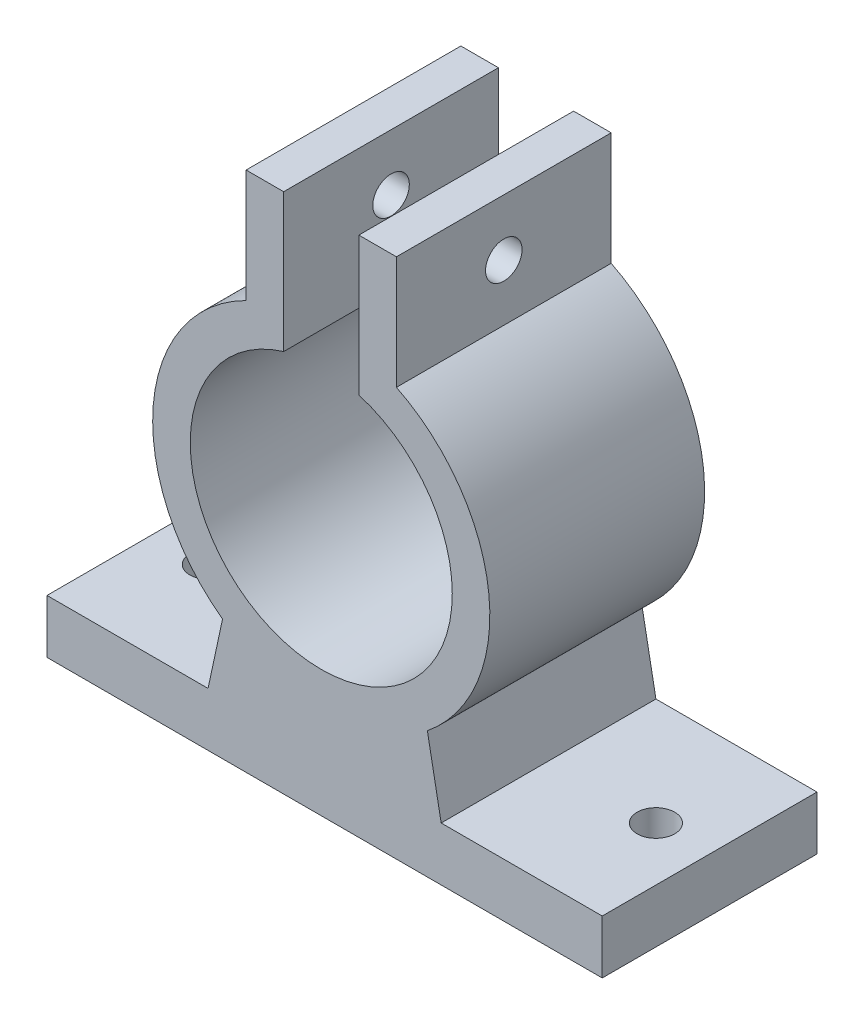
ISO-10303-21;
HEADER;
FILE_DESCRIPTION(('STEP AP214'),'2;1');
FILE_NAME('part.step','',(''),(''),'','','');
FILE_SCHEMA(('AUTOMOTIVE_DESIGN { 1 0 10303 214 1 1 1 1 }'));
ENDSEC;
DATA;
#1=APPLICATION_CONTEXT('core data for automotive mechanical design processes');
#2=APPLICATION_PROTOCOL_DEFINITION('international standard','automotive_design',2000,#1);
#3=PRODUCT_CONTEXT('',#1,'mechanical');
#4=PRODUCT('Part','Part','',(#3));
#5=PRODUCT_RELATED_PRODUCT_CATEGORY('part','',(#4));
#6=PRODUCT_DEFINITION_FORMATION('','',#4);
#7=PRODUCT_DEFINITION_CONTEXT('part definition',#1,'design');
#8=PRODUCT_DEFINITION('design','',#6,#7);
#9=PRODUCT_DEFINITION_SHAPE('','',#8);
#10=(LENGTH_UNIT() NAMED_UNIT(*) SI_UNIT(.MILLI.,.METRE.));
#11=(NAMED_UNIT(*) PLANE_ANGLE_UNIT() SI_UNIT($,.RADIAN.));
#12=(NAMED_UNIT(*) SI_UNIT($,.STERADIAN.) SOLID_ANGLE_UNIT());
#13=UNCERTAINTY_MEASURE_WITH_UNIT(LENGTH_MEASURE(1.E-05),#10,'distance_accuracy_value','');
#14=(GEOMETRIC_REPRESENTATION_CONTEXT(3) GLOBAL_UNCERTAINTY_ASSIGNED_CONTEXT((#13)) GLOBAL_UNIT_ASSIGNED_CONTEXT((#10,
#11,#12)) REPRESENTATION_CONTEXT('',''));
#15=CARTESIAN_POINT('',(0.,0.,0.));
#16=DIRECTION('',(0.,0.,1.));
#17=DIRECTION('',(1.,0.,0.));
#18=AXIS2_PLACEMENT_3D('',#15,#16,#17);
#19=CARTESIAN_POINT('',(0.,0.,20.));
#20=DIRECTION('',(0.,0.,-1.));
#21=DIRECTION('',(-1.,0.,0.));
#22=AXIS2_PLACEMENT_3D('',#19,#20,#21);
#23=CYLINDRICAL_SURFACE('',#22,15.7);
#24=CARTESIAN_POINT('',(0.,0.,0.));
#25=DIRECTION('',(0.,0.,1.));
#26=DIRECTION('',(1.,0.,0.));
#27=AXIS2_PLACEMENT_3D('',#24,#25,#26);
#28=CIRCLE('',#27,15.7);
#29=CARTESIAN_POINT('',(-7.,14.053113534018,0.));
#30=VERTEX_POINT('',#29);
#31=CARTESIAN_POINT('',(-9.19317791023772,-12.7269587848283,0.));
#32=VERTEX_POINT('',#31);
#33=EDGE_CURVE('E149',#30,#32,#28,.T.);
#34=ORIENTED_EDGE('',*,*,#33,.T.);
#35=DIRECTION('',(0.,0.,-1.));
#36=VECTOR('',#35,1.);
#37=CARTESIAN_POINT('',(-9.19317791023772,-12.7269587848283,20.));
#38=LINE('',#37,#36);
#39=CARTESIAN_POINT('',(-9.19317791023772,-12.7269587848283,20.));
#40=VERTEX_POINT('',#39);
#41=EDGE_CURVE('E11',#40,#32,#38,.T.);
#42=ORIENTED_EDGE('',*,*,#41,.F.);
#43=CARTESIAN_POINT('',(0.,0.,20.));
#44=DIRECTION('',(0.,0.,1.));
#45=DIRECTION('',(1.,0.,0.));
#46=AXIS2_PLACEMENT_3D('',#43,#44,#45);
#47=CIRCLE('',#46,15.7);
#48=CARTESIAN_POINT('',(-7.,14.053113534018,20.));
#49=VERTEX_POINT('',#48);
#50=EDGE_CURVE('E177',#49,#40,#47,.T.);
#51=ORIENTED_EDGE('',*,*,#50,.F.);
#52=DIRECTION('',(0.,0.,-1.));
#53=VECTOR('',#52,1.);
#54=CARTESIAN_POINT('',(-7.,14.053113534018,20.));
#55=LINE('',#54,#53);
#56=EDGE_CURVE('E145',#49,#30,#55,.T.);
#57=ORIENTED_EDGE('',*,*,#56,.T.);
#58=EDGE_LOOP('',(#34,#42,#51,#57));
#59=FACE_BOUND('',#58,.T.);
#60=ADVANCED_FACE('F35',(#59),#23,.T.);
#61=CARTESIAN_POINT('',(-6.17251340668323,1.32670669915488,20.));
#62=DIRECTION('',(0.977671601034044,-0.210138622179572,0.));
#63=DIRECTION('',(0.210138622179572,0.977671601034044,0.));
#64=AXIS2_PLACEMENT_3D('',#61,#62,#63);
#65=PLANE('',#64);
#66=DIRECTION('',(-0.210138622179572,-0.977671601034044,0.));
#67=VECTOR('',#66,1.);
#68=CARTESIAN_POINT('',(-6.17251340668323,1.32670669915488,0.));
#69=LINE('',#68,#67);
#70=CARTESIAN_POINT('',(-10.5414918394115,-19.,0.));
#71=VERTEX_POINT('',#70);
#72=EDGE_CURVE('E152',#32,#71,#69,.T.);
#73=ORIENTED_EDGE('',*,*,#72,.T.);
#74=DIRECTION('',(0.,0.,1.));
#75=VECTOR('',#74,1.);
#76=CARTESIAN_POINT('',(-10.5414918394115,-19.,20.));
#77=LINE('',#76,#75);
#78=CARTESIAN_POINT('',(-10.5414918394115,-19.,20.));
#79=VERTEX_POINT('',#78);
#80=EDGE_CURVE('E248',#71,#79,#77,.T.);
#81=ORIENTED_EDGE('',*,*,#80,.T.);
#82=DIRECTION('',(-0.210138622179572,-0.977671601034044,0.));
#83=VECTOR('',#82,1.);
#84=CARTESIAN_POINT('',(-6.17251340668323,1.32670669915488,20.));
#85=LINE('',#84,#83);
#86=EDGE_CURVE('E103',#40,#79,#85,.T.);
#87=ORIENTED_EDGE('',*,*,#86,.F.);
#88=ORIENTED_EDGE('',*,*,#41,.T.);
#89=EDGE_LOOP('',(#73,#81,#87,#88));
#90=FACE_BOUND('',#89,.T.);
#91=ADVANCED_FACE('F293',(#90),#65,.F.);
#92=CARTESIAN_POINT('',(7.31612062586537,1.38203384347365,20.));
#93=DIRECTION('',(0.982621653309237,0.185619736148455,0.));
#94=DIRECTION('',(-0.185619736148455,0.982621653309237,0.));
#95=AXIS2_PLACEMENT_3D('',#92,#93,#94);
#96=PLANE('',#95);
#97=DIRECTION('',(0.,0.,1.));
#98=VECTOR('',#97,1.);
#99=CARTESIAN_POINT('',(11.16633879626,-19.,20.));
#100=LINE('',#99,#98);
#101=CARTESIAN_POINT('',(11.16633879626,-19.,0.));
#102=VERTEX_POINT('',#101);
#103=CARTESIAN_POINT('',(11.16633879626,-19.,20.));
#104=VERTEX_POINT('',#103);
#105=EDGE_CURVE('E245',#102,#104,#100,.T.);
#106=ORIENTED_EDGE('',*,*,#105,.F.);
#107=DIRECTION('',(0.185619736148455,-0.982621653309237,0.));
#108=VECTOR('',#107,1.);
#109=CARTESIAN_POINT('',(7.31612062586537,1.38203384347365,0.));
#110=LINE('',#109,#108);
#111=CARTESIAN_POINT('',(9.88180145520036,-12.2,0.));
#112=VERTEX_POINT('',#111);
#113=EDGE_CURVE('E156',#112,#102,#110,.T.);
#114=ORIENTED_EDGE('',*,*,#113,.F.);
#115=DIRECTION('',(0.,0.,-1.));
#116=VECTOR('',#115,1.);
#117=CARTESIAN_POINT('',(9.88180145520036,-12.2,20.));
#118=LINE('',#117,#116);
#119=CARTESIAN_POINT('',(9.88180145520036,-12.2,20.));
#120=VERTEX_POINT('',#119);
#121=EDGE_CURVE('E44',#120,#112,#118,.T.);
#122=ORIENTED_EDGE('',*,*,#121,.F.);
#123=DIRECTION('',(0.185619736148455,-0.982621653309237,0.));
#124=VECTOR('',#123,1.);
#125=CARTESIAN_POINT('',(7.31612062586537,1.38203384347365,20.));
#126=LINE('',#125,#124);
#127=EDGE_CURVE('E258',#120,#104,#126,.T.);
#128=ORIENTED_EDGE('',*,*,#127,.T.);
#129=EDGE_LOOP('',(#106,#114,#122,#128));
#130=FACE_BOUND('',#129,.T.);
#131=ADVANCED_FACE('F297',(#130),#96,.T.);
#132=CARTESIAN_POINT('',(0.,0.,20.));
#133=DIRECTION('',(0.,0.,-1.));
#134=DIRECTION('',(-1.,0.,0.));
#135=AXIS2_PLACEMENT_3D('',#132,#133,#134);
#136=CYLINDRICAL_SURFACE('',#135,15.7);
#137=CARTESIAN_POINT('',(0.,0.,0.));
#138=DIRECTION('',(0.,0.,1.));
#139=DIRECTION('',(1.,0.,0.));
#140=AXIS2_PLACEMENT_3D('',#137,#138,#139);
#141=CIRCLE('',#140,15.7);
#142=CARTESIAN_POINT('',(7.,14.053113534018,0.));
#143=VERTEX_POINT('',#142);
#144=EDGE_CURVE('E159',#112,#143,#141,.T.);
#145=ORIENTED_EDGE('',*,*,#144,.T.);
#146=DIRECTION('',(0.,0.,-1.));
#147=VECTOR('',#146,1.);
#148=CARTESIAN_POINT('',(7.,14.053113534018,20.));
#149=LINE('',#148,#147);
#150=CARTESIAN_POINT('',(7.,14.053113534018,20.));
#151=VERTEX_POINT('',#150);
#152=EDGE_CURVE('E187',#151,#143,#149,.T.);
#153=ORIENTED_EDGE('',*,*,#152,.F.);
#154=CARTESIAN_POINT('',(0.,0.,20.));
#155=DIRECTION('',(0.,0.,1.));
#156=DIRECTION('',(1.,0.,0.));
#157=AXIS2_PLACEMENT_3D('',#154,#155,#156);
#158=CIRCLE('',#157,15.7);
#159=EDGE_CURVE('E261',#120,#151,#158,.T.);
#160=ORIENTED_EDGE('',*,*,#159,.F.);
#161=ORIENTED_EDGE('',*,*,#121,.T.);
#162=EDGE_LOOP('',(#145,#153,#160,#161));
#163=FACE_BOUND('',#162,.T.);
#164=ADVANCED_FACE('F301',(#163),#136,.T.);
#165=CARTESIAN_POINT('',(7.,0.,20.));
#166=DIRECTION('',(1.,0.,0.));
#167=DIRECTION('',(0.,0.,-1.));
#168=AXIS2_PLACEMENT_3D('',#165,#166,#167);
#169=PLANE('',#168);
#170=CARTESIAN_POINT('',(7.,19.3167839227986,10.));
#171=DIRECTION('',(1.,0.,0.));
#172=DIRECTION('',(0.,0.,-1.));
#173=AXIS2_PLACEMENT_3D('',#170,#171,#172);
#174=CIRCLE('',#173,1.7);
#175=CARTESIAN_POINT('',(7.,19.3167839227986,8.3));
#176=VERTEX_POINT('',#175);
#177=EDGE_CURVE('E193',#176,#176,#174,.T.);
#178=ORIENTED_EDGE('',*,*,#177,.F.);
#179=EDGE_LOOP('',(#178));
#180=FACE_BOUND('',#179,.T.);
#181=DIRECTION('',(0.,-1.,0.));
#182=VECTOR('',#181,1.);
#183=CARTESIAN_POINT('',(7.,0.,0.));
#184=LINE('',#183,#182);
#185=CARTESIAN_POINT('',(7.,24.5804543115792,0.));
#186=VERTEX_POINT('',#185);
#187=EDGE_CURVE('E162',#186,#143,#184,.T.);
#188=ORIENTED_EDGE('',*,*,#187,.F.);
#189=DIRECTION('',(0.,0.,-1.));
#190=VECTOR('',#189,1.);
#191=CARTESIAN_POINT('',(7.,24.5804543115792,20.));
#192=LINE('',#191,#190);
#193=CARTESIAN_POINT('',(7.,24.5804543115792,20.));
#194=VERTEX_POINT('',#193);
#195=EDGE_CURVE('E185',#194,#186,#192,.T.);
#196=ORIENTED_EDGE('',*,*,#195,.F.);
#197=DIRECTION('',(0.,-1.,0.));
#198=VECTOR('',#197,1.);
#199=CARTESIAN_POINT('',(7.,0.,20.));
#200=LINE('',#199,#198);
#201=EDGE_CURVE('E263',#194,#151,#200,.T.);
#202=ORIENTED_EDGE('',*,*,#201,.T.);
#203=ORIENTED_EDGE('',*,*,#152,.T.);
#204=EDGE_LOOP('',(#188,#196,#202,#203));
#205=FACE_BOUND('',#204,.T.);
#206=ADVANCED_FACE('F307',(#180,#205),#169,.T.);
#207=CARTESIAN_POINT('',(0.,24.5804543115792,20.));
#208=DIRECTION('',(0.,1.,0.));
#209=DIRECTION('',(0.,0.,1.));
#210=AXIS2_PLACEMENT_3D('',#207,#208,#209);
#211=PLANE('',#210);
#212=DIRECTION('',(1.,0.,0.));
#213=VECTOR('',#212,1.);
#214=CARTESIAN_POINT('',(0.,24.5804543115792,0.));
#215=LINE('',#214,#213);
#216=CARTESIAN_POINT('',(3.5,24.5804543115792,0.));
#217=VERTEX_POINT('',#216);
#218=EDGE_CURVE('E165',#217,#186,#215,.T.);
#219=ORIENTED_EDGE('',*,*,#218,.F.);
#220=DIRECTION('',(0.,0.,-1.));
#221=VECTOR('',#220,1.);
#222=CARTESIAN_POINT('',(3.5,24.5804543115792,20.));
#223=LINE('',#222,#221);
#224=CARTESIAN_POINT('',(3.5,24.5804543115792,20.));
#225=VERTEX_POINT('',#224);
#226=EDGE_CURVE('E183',#225,#217,#223,.T.);
#227=ORIENTED_EDGE('',*,*,#226,.F.);
#228=DIRECTION('',(1.,0.,0.));
#229=VECTOR('',#228,1.);
#230=CARTESIAN_POINT('',(0.,24.5804543115792,20.));
#231=LINE('',#230,#229);
#232=EDGE_CURVE('E266',#225,#194,#231,.T.);
#233=ORIENTED_EDGE('',*,*,#232,.T.);
#234=ORIENTED_EDGE('',*,*,#195,.T.);
#235=EDGE_LOOP('',(#219,#227,#233,#234));
#236=FACE_BOUND('',#235,.T.);
#237=ADVANCED_FACE('F311',(#236),#211,.T.);
#238=CARTESIAN_POINT('',(3.5,0.,20.));
#239=DIRECTION('',(-1.,0.,0.));
#240=DIRECTION('',(0.,0.,1.));
#241=AXIS2_PLACEMENT_3D('',#238,#239,#240);
#242=PLANE('',#241);
#243=CARTESIAN_POINT('',(3.5,19.3167839227986,10.));
#244=DIRECTION('',(-1.,0.,0.));
#245=DIRECTION('',(0.,0.,1.));
#246=AXIS2_PLACEMENT_3D('',#243,#244,#245);
#247=CIRCLE('',#246,1.7);
#248=CARTESIAN_POINT('',(3.5,19.3167839227986,11.7));
#249=VERTEX_POINT('',#248);
#250=EDGE_CURVE('E153',#249,#249,#247,.T.);
#251=ORIENTED_EDGE('',*,*,#250,.F.);
#252=EDGE_LOOP('',(#251));
#253=FACE_BOUND('',#252,.T.);
#254=DIRECTION('',(0.,1.,0.));
#255=VECTOR('',#254,1.);
#256=CARTESIAN_POINT('',(3.5,0.,0.));
#257=LINE('',#256,#255);
#258=CARTESIAN_POINT('',(3.5,11.6871724553033,0.));
#259=VERTEX_POINT('',#258);
#260=EDGE_CURVE('E168',#259,#217,#257,.T.);
#261=ORIENTED_EDGE('',*,*,#260,.F.);
#262=DIRECTION('',(0.,0.,-1.));
#263=VECTOR('',#262,1.);
#264=CARTESIAN_POINT('',(3.5,11.6871724553033,20.));
#265=LINE('',#264,#263);
#266=CARTESIAN_POINT('',(3.5,11.6871724553033,20.));
#267=VERTEX_POINT('',#266);
#268=EDGE_CURVE('E181',#267,#259,#265,.T.);
#269=ORIENTED_EDGE('',*,*,#268,.F.);
#270=DIRECTION('',(0.,1.,0.));
#271=VECTOR('',#270,1.);
#272=CARTESIAN_POINT('',(3.5,0.,20.));
#273=LINE('',#272,#271);
#274=EDGE_CURVE('E269',#267,#225,#273,.T.);
#275=ORIENTED_EDGE('',*,*,#274,.T.);
#276=ORIENTED_EDGE('',*,*,#226,.T.);
#277=EDGE_LOOP('',(#261,#269,#275,#276));
#278=FACE_BOUND('',#277,.T.);
#279=ADVANCED_FACE('F315',(#253,#278),#242,.T.);
#280=CARTESIAN_POINT('',(0.,0.,20.));
#281=DIRECTION('',(0.,0.,-1.));
#282=DIRECTION('',(-1.,0.,0.));
#283=AXIS2_PLACEMENT_3D('',#280,#281,#282);
#284=CYLINDRICAL_SURFACE('',#283,12.2);
#285=CARTESIAN_POINT('',(0.,0.,0.));
#286=DIRECTION('',(0.,0.,1.));
#287=DIRECTION('',(1.,0.,0.));
#288=AXIS2_PLACEMENT_3D('',#285,#286,#287);
#289=CIRCLE('',#288,12.2);
#290=CARTESIAN_POINT('',(-3.5,11.6871724553033,0.));
#291=VERTEX_POINT('',#290);
#292=EDGE_CURVE('E171',#291,#259,#289,.T.);
#293=ORIENTED_EDGE('',*,*,#292,.F.);
#294=DIRECTION('',(0.,0.,-1.));
#295=VECTOR('',#294,1.);
#296=CARTESIAN_POINT('',(-3.5,11.6871724553033,20.));
#297=LINE('',#296,#295);
#298=CARTESIAN_POINT('',(-3.5,11.6871724553033,20.));
#299=VERTEX_POINT('',#298);
#300=EDGE_CURVE('E140',#299,#291,#297,.T.);
#301=ORIENTED_EDGE('',*,*,#300,.F.);
#302=CARTESIAN_POINT('',(0.,0.,20.));
#303=DIRECTION('',(0.,0.,1.));
#304=DIRECTION('',(1.,0.,0.));
#305=AXIS2_PLACEMENT_3D('',#302,#303,#304);
#306=CIRCLE('',#305,12.2);
#307=EDGE_CURVE('E133',#299,#267,#306,.T.);
#308=ORIENTED_EDGE('',*,*,#307,.T.);
#309=ORIENTED_EDGE('',*,*,#268,.T.);
#310=EDGE_LOOP('',(#293,#301,#308,#309));
#311=FACE_BOUND('',#310,.T.);
#312=ADVANCED_FACE('F273',(#311),#284,.F.);
#313=CARTESIAN_POINT('',(-3.5,0.,20.));
#314=DIRECTION('',(-1.,0.,0.));
#315=DIRECTION('',(0.,0.,1.));
#316=AXIS2_PLACEMENT_3D('',#313,#314,#315);
#317=PLANE('',#316);
#318=CARTESIAN_POINT('',(-3.5,19.3167839227986,10.));
#319=DIRECTION('',(-1.,0.,0.));
#320=DIRECTION('',(0.,0.,1.));
#321=AXIS2_PLACEMENT_3D('',#318,#319,#320);
#322=CIRCLE('',#321,1.7);
#323=CARTESIAN_POINT('',(-3.5,19.3167839227986,11.7));
#324=VERTEX_POINT('',#323);
#325=EDGE_CURVE('E192',#324,#324,#322,.T.);
#326=ORIENTED_EDGE('',*,*,#325,.T.);
#327=EDGE_LOOP('',(#326));
#328=FACE_BOUND('',#327,.T.);
#329=DIRECTION('',(0.,1.,0.));
#330=VECTOR('',#329,1.);
#331=CARTESIAN_POINT('',(-3.5,0.,0.));
#332=LINE('',#331,#330);
#333=CARTESIAN_POINT('',(-3.5,24.5804543115792,0.));
#334=VERTEX_POINT('',#333);
#335=EDGE_CURVE('E139',#291,#334,#332,.T.);
#336=ORIENTED_EDGE('',*,*,#335,.T.);
#337=DIRECTION('',(0.,0.,-1.));
#338=VECTOR('',#337,1.);
#339=CARTESIAN_POINT('',(-3.5,24.5804543115792,20.));
#340=LINE('',#339,#338);
#341=CARTESIAN_POINT('',(-3.5,24.5804543115792,20.));
#342=VERTEX_POINT('',#341);
#343=EDGE_CURVE('E136',#342,#334,#340,.T.);
#344=ORIENTED_EDGE('',*,*,#343,.F.);
#345=DIRECTION('',(0.,1.,0.));
#346=VECTOR('',#345,1.);
#347=CARTESIAN_POINT('',(-3.5,0.,20.));
#348=LINE('',#347,#346);
#349=EDGE_CURVE('E126',#299,#342,#348,.T.);
#350=ORIENTED_EDGE('',*,*,#349,.F.);
#351=ORIENTED_EDGE('',*,*,#300,.T.);
#352=EDGE_LOOP('',(#336,#344,#350,#351));
#353=FACE_BOUND('',#352,.T.);
#354=ADVANCED_FACE('F137',(#328,#353),#317,.F.);
#355=CARTESIAN_POINT('',(0.,24.5804543115792,20.));
#356=DIRECTION('',(0.,-1.,0.));
#357=DIRECTION('',(0.,0.,-1.));
#358=AXIS2_PLACEMENT_3D('',#355,#356,#357);
#359=PLANE('',#358);
#360=DIRECTION('',(-1.,0.,0.));
#361=VECTOR('',#360,1.);
#362=CARTESIAN_POINT('',(0.,24.5804543115792,0.));
#363=LINE('',#362,#361);
#364=CARTESIAN_POINT('',(-7.,24.5804543115792,0.));
#365=VERTEX_POINT('',#364);
#366=EDGE_CURVE('E89',#334,#365,#363,.T.);
#367=ORIENTED_EDGE('',*,*,#366,.T.);
#368=DIRECTION('',(0.,0.,-1.));
#369=VECTOR('',#368,1.);
#370=CARTESIAN_POINT('',(-7.,24.5804543115792,20.));
#371=LINE('',#370,#369);
#372=CARTESIAN_POINT('',(-7.,24.5804543115792,20.));
#373=VERTEX_POINT('',#372);
#374=EDGE_CURVE('E141',#373,#365,#371,.T.);
#375=ORIENTED_EDGE('',*,*,#374,.F.);
#376=DIRECTION('',(-1.,0.,0.));
#377=VECTOR('',#376,1.);
#378=CARTESIAN_POINT('',(0.,24.5804543115792,20.));
#379=LINE('',#378,#377);
#380=EDGE_CURVE('E130',#342,#373,#379,.T.);
#381=ORIENTED_EDGE('',*,*,#380,.F.);
#382=ORIENTED_EDGE('',*,*,#343,.T.);
#383=EDGE_LOOP('',(#367,#375,#381,#382));
#384=FACE_BOUND('',#383,.T.);
#385=ADVANCED_FACE('F143',(#384),#359,.F.);
#386=CARTESIAN_POINT('',(-7.,0.,20.));
#387=DIRECTION('',(1.,0.,0.));
#388=DIRECTION('',(0.,0.,-1.));
#389=AXIS2_PLACEMENT_3D('',#386,#387,#388);
#390=PLANE('',#389);
#391=CARTESIAN_POINT('',(-7.,19.3167839227986,10.));
#392=DIRECTION('',(1.,0.,0.));
#393=DIRECTION('',(0.,0.,-1.));
#394=AXIS2_PLACEMENT_3D('',#391,#392,#393);
#395=CIRCLE('',#394,1.7);
#396=CARTESIAN_POINT('',(-7.,19.3167839227986,8.3));
#397=VERTEX_POINT('',#396);
#398=EDGE_CURVE('E190',#397,#397,#395,.T.);
#399=ORIENTED_EDGE('',*,*,#398,.T.);
#400=EDGE_LOOP('',(#399));
#401=FACE_BOUND('',#400,.T.);
#402=DIRECTION('',(0.,-1.,0.));
#403=VECTOR('',#402,1.);
#404=CARTESIAN_POINT('',(-7.,0.,0.));
#405=LINE('',#404,#403);
#406=EDGE_CURVE('E95',#365,#30,#405,.T.);
#407=ORIENTED_EDGE('',*,*,#406,.T.);
#408=ORIENTED_EDGE('',*,*,#56,.F.);
#409=DIRECTION('',(0.,-1.,0.));
#410=VECTOR('',#409,1.);
#411=CARTESIAN_POINT('',(-7.,0.,20.));
#412=LINE('',#411,#410);
#413=EDGE_CURVE('E53',#373,#49,#412,.T.);
#414=ORIENTED_EDGE('',*,*,#413,.F.);
#415=ORIENTED_EDGE('',*,*,#374,.T.);
#416=EDGE_LOOP('',(#407,#408,#414,#415));
#417=FACE_BOUND('',#416,.T.);
#418=ADVANCED_FACE('F281',(#401,#417),#390,.F.);
#419=CARTESIAN_POINT('',(0.,0.,20.));
#420=DIRECTION('',(0.,0.,1.));
#421=DIRECTION('',(1.,0.,0.));
#422=AXIS2_PLACEMENT_3D('',#419,#420,#421);
#423=PLANE('',#422);
#424=ORIENTED_EDGE('',*,*,#86,.T.);
#425=DIRECTION('',(-1.,0.,0.));
#426=VECTOR('',#425,1.);
#427=CARTESIAN_POINT('',(26.16633879626,-19.,20.));
#428=LINE('',#427,#426);
#429=CARTESIAN_POINT('',(-25.5414918394115,-19.,20.));
#430=VERTEX_POINT('',#429);
#431=EDGE_CURVE('E228',#79,#430,#428,.T.);
#432=ORIENTED_EDGE('',*,*,#431,.T.);
#433=DIRECTION('',(0.,-1.,0.));
#434=VECTOR('',#433,1.);
#435=CARTESIAN_POINT('',(-25.5414918394115,-19.,20.));
#436=LINE('',#435,#434);
#437=CARTESIAN_POINT('',(-25.5414918394115,-24.,20.));
#438=VERTEX_POINT('',#437);
#439=EDGE_CURVE('E196',#430,#438,#436,.T.);
#440=ORIENTED_EDGE('',*,*,#439,.T.);
#441=DIRECTION('',(1.,0.,0.));
#442=VECTOR('',#441,1.);
#443=CARTESIAN_POINT('',(11.16633879626,-24.,20.));
#444=LINE('',#443,#442);
#445=CARTESIAN_POINT('',(26.16633879626,-24.,20.));
#446=VERTEX_POINT('',#445);
#447=EDGE_CURVE('E201',#438,#446,#444,.T.);
#448=ORIENTED_EDGE('',*,*,#447,.T.);
#449=DIRECTION('',(0.,1.,0.));
#450=VECTOR('',#449,1.);
#451=CARTESIAN_POINT('',(26.16633879626,-24.,20.));
#452=LINE('',#451,#450);
#453=CARTESIAN_POINT('',(26.16633879626,-19.,20.));
#454=VERTEX_POINT('',#453);
#455=EDGE_CURVE('E225',#446,#454,#452,.T.);
#456=ORIENTED_EDGE('',*,*,#455,.T.);
#457=EDGE_CURVE('E229',#454,#104,#428,.T.);
#458=ORIENTED_EDGE('',*,*,#457,.T.);
#459=ORIENTED_EDGE('',*,*,#127,.F.);
#460=ORIENTED_EDGE('',*,*,#159,.T.);
#461=ORIENTED_EDGE('',*,*,#201,.F.);
#462=ORIENTED_EDGE('',*,*,#232,.F.);
#463=ORIENTED_EDGE('',*,*,#274,.F.);
#464=ORIENTED_EDGE('',*,*,#307,.F.);
#465=ORIENTED_EDGE('',*,*,#349,.T.);
#466=ORIENTED_EDGE('',*,*,#380,.T.);
#467=ORIENTED_EDGE('',*,*,#413,.T.);
#468=ORIENTED_EDGE('',*,*,#50,.T.);
#469=EDGE_LOOP('',(#424,#432,#440,#448,#456,#458,#459,#460,#461,#462,#463,#464,#465,#466,#467,#468));
#470=FACE_BOUND('',#469,.T.);
#471=ADVANCED_FACE('F128',(#470),#423,.T.);
#472=CARTESIAN_POINT('',(0.,0.,0.));
#473=DIRECTION('',(0.,0.,1.));
#474=DIRECTION('',(1.,0.,0.));
#475=AXIS2_PLACEMENT_3D('',#472,#473,#474);
#476=PLANE('',#475);
#477=ORIENTED_EDGE('',*,*,#113,.T.);
#478=DIRECTION('',(1.,0.,0.));
#479=VECTOR('',#478,1.);
#480=CARTESIAN_POINT('',(26.16633879626,-19.,0.));
#481=LINE('',#480,#479);
#482=CARTESIAN_POINT('',(26.16633879626,-19.,0.));
#483=VERTEX_POINT('',#482);
#484=EDGE_CURVE('E218',#102,#483,#481,.T.);
#485=ORIENTED_EDGE('',*,*,#484,.T.);
#486=DIRECTION('',(0.,-1.,0.));
#487=VECTOR('',#486,1.);
#488=CARTESIAN_POINT('',(26.16633879626,-24.,0.));
#489=LINE('',#488,#487);
#490=CARTESIAN_POINT('',(26.16633879626,-24.,0.));
#491=VERTEX_POINT('',#490);
#492=EDGE_CURVE('E214',#483,#491,#489,.T.);
#493=ORIENTED_EDGE('',*,*,#492,.T.);
#494=DIRECTION('',(-1.,0.,0.));
#495=VECTOR('',#494,1.);
#496=CARTESIAN_POINT('',(11.16633879626,-24.,0.));
#497=LINE('',#496,#495);
#498=CARTESIAN_POINT('',(-25.5414918394115,-24.,0.));
#499=VERTEX_POINT('',#498);
#500=EDGE_CURVE('E211',#491,#499,#497,.T.);
#501=ORIENTED_EDGE('',*,*,#500,.T.);
#502=DIRECTION('',(0.,1.,0.));
#503=VECTOR('',#502,1.);
#504=CARTESIAN_POINT('',(-25.5414918394115,-19.,0.));
#505=LINE('',#504,#503);
#506=CARTESIAN_POINT('',(-25.5414918394115,-19.,0.));
#507=VERTEX_POINT('',#506);
#508=EDGE_CURVE('E221',#499,#507,#505,.T.);
#509=ORIENTED_EDGE('',*,*,#508,.T.);
#510=EDGE_CURVE('E219',#507,#71,#481,.T.);
#511=ORIENTED_EDGE('',*,*,#510,.T.);
#512=ORIENTED_EDGE('',*,*,#72,.F.);
#513=ORIENTED_EDGE('',*,*,#33,.F.);
#514=ORIENTED_EDGE('',*,*,#406,.F.);
#515=ORIENTED_EDGE('',*,*,#366,.F.);
#516=ORIENTED_EDGE('',*,*,#335,.F.);
#517=ORIENTED_EDGE('',*,*,#292,.T.);
#518=ORIENTED_EDGE('',*,*,#260,.T.);
#519=ORIENTED_EDGE('',*,*,#218,.T.);
#520=ORIENTED_EDGE('',*,*,#187,.T.);
#521=ORIENTED_EDGE('',*,*,#144,.F.);
#522=EDGE_LOOP('',(#477,#485,#493,#501,#509,#511,#512,#513,#514,#515,#516,#517,#518,#519,#520,#521));
#523=FACE_BOUND('',#522,.T.);
#524=ADVANCED_FACE('F276',(#523),#476,.F.);
#525=CARTESIAN_POINT('',(-13.,19.3167839227986,10.));
#526=DIRECTION('',(1.,0.,0.));
#527=DIRECTION('',(0.,0.,-1.));
#528=AXIS2_PLACEMENT_3D('',#525,#526,#527);
#529=CYLINDRICAL_SURFACE('',#528,1.7);
#530=ORIENTED_EDGE('',*,*,#398,.F.);
#531=EDGE_LOOP('',(#530));
#532=FACE_BOUND('',#531,.T.);
#533=ORIENTED_EDGE('',*,*,#325,.F.);
#534=EDGE_LOOP('',(#533));
#535=FACE_BOUND('',#534,.T.);
#536=ADVANCED_FACE('F328',(#532,#535),#529,.F.);
#537=ORIENTED_EDGE('',*,*,#250,.T.);
#538=EDGE_LOOP('',(#537));
#539=FACE_BOUND('',#538,.T.);
#540=ORIENTED_EDGE('',*,*,#177,.T.);
#541=EDGE_LOOP('',(#540));
#542=FACE_BOUND('',#541,.T.);
#543=ADVANCED_FACE('F330',(#539,#542),#529,.F.);
#544=CARTESIAN_POINT('',(26.16633879626,-19.,-51.9490110497523));
#545=DIRECTION('',(0.,1.,0.));
#546=DIRECTION('',(0.,0.,1.));
#547=AXIS2_PLACEMENT_3D('',#544,#545,#546);
#548=PLANE('',#547);
#549=CARTESIAN_POINT('',(-20.5414918394115,-19.,10.));
#550=DIRECTION('',(0.,1.,0.));
#551=DIRECTION('',(0.,0.,1.));
#552=AXIS2_PLACEMENT_3D('',#549,#550,#551);
#553=CIRCLE('',#552,1.7);
#554=CARTESIAN_POINT('',(-20.5414918394115,-19.,11.7));
#555=VERTEX_POINT('',#554);
#556=EDGE_CURVE('E197',#555,#555,#553,.T.);
#557=ORIENTED_EDGE('',*,*,#556,.F.);
#558=EDGE_LOOP('',(#557));
#559=FACE_BOUND('',#558,.T.);
#560=ORIENTED_EDGE('',*,*,#80,.F.);
#561=ORIENTED_EDGE('',*,*,#510,.F.);
#562=DIRECTION('',(0.,0.,1.));
#563=VECTOR('',#562,1.);
#564=CARTESIAN_POINT('',(-25.5414918394115,-19.,-51.9490110497523));
#565=LINE('',#564,#563);
#566=EDGE_CURVE('E232',#507,#430,#565,.T.);
#567=ORIENTED_EDGE('',*,*,#566,.T.);
#568=ORIENTED_EDGE('',*,*,#431,.F.);
#569=EDGE_LOOP('',(#560,#561,#567,#568));
#570=FACE_BOUND('',#569,.T.);
#571=ADVANCED_FACE('F337',(#559,#570),#548,.T.);
#572=CARTESIAN_POINT('',(21.16633879626,-19.,10.));
#573=DIRECTION('',(0.,1.,0.));
#574=DIRECTION('',(0.,0.,1.));
#575=AXIS2_PLACEMENT_3D('',#572,#573,#574);
#576=CIRCLE('',#575,1.75);
#577=CARTESIAN_POINT('',(21.16633879626,-19.,11.75));
#578=VERTEX_POINT('',#577);
#579=EDGE_CURVE('E208',#578,#578,#576,.T.);
#580=ORIENTED_EDGE('',*,*,#579,.F.);
#581=EDGE_LOOP('',(#580));
#582=FACE_BOUND('',#581,.T.);
#583=ORIENTED_EDGE('',*,*,#484,.F.);
#584=ORIENTED_EDGE('',*,*,#105,.T.);
#585=ORIENTED_EDGE('',*,*,#457,.F.);
#586=DIRECTION('',(0.,0.,1.));
#587=VECTOR('',#586,1.);
#588=CARTESIAN_POINT('',(26.16633879626,-19.,-51.9490110497523));
#589=LINE('',#588,#587);
#590=EDGE_CURVE('E215',#483,#454,#589,.T.);
#591=ORIENTED_EDGE('',*,*,#590,.F.);
#592=EDGE_LOOP('',(#583,#584,#585,#591));
#593=FACE_BOUND('',#592,.T.);
#594=ADVANCED_FACE('F353',(#582,#593),#548,.T.);
#595=CARTESIAN_POINT('',(26.16633879626,-24.,-51.9490110497523));
#596=DIRECTION('',(1.,0.,0.));
#597=DIRECTION('',(0.,0.,-1.));
#598=AXIS2_PLACEMENT_3D('',#595,#596,#597);
#599=PLANE('',#598);
#600=ORIENTED_EDGE('',*,*,#492,.F.);
#601=ORIENTED_EDGE('',*,*,#590,.T.);
#602=ORIENTED_EDGE('',*,*,#455,.F.);
#603=DIRECTION('',(0.,0.,1.));
#604=VECTOR('',#603,1.);
#605=CARTESIAN_POINT('',(26.16633879626,-24.,-51.9490110497523));
#606=LINE('',#605,#604);
#607=EDGE_CURVE('E235',#491,#446,#606,.T.);
#608=ORIENTED_EDGE('',*,*,#607,.F.);
#609=EDGE_LOOP('',(#600,#601,#602,#608));
#610=FACE_BOUND('',#609,.T.);
#611=ADVANCED_FACE('F349',(#610),#599,.T.);
#612=CARTESIAN_POINT('',(11.16633879626,-24.,-51.9490110497523));
#613=DIRECTION('',(0.,-1.,0.));
#614=DIRECTION('',(0.,0.,-1.));
#615=AXIS2_PLACEMENT_3D('',#612,#613,#614);
#616=PLANE('',#615);
#617=CARTESIAN_POINT('',(21.16633879626,-24.,10.));
#618=DIRECTION('',(0.,-1.,0.));
#619=DIRECTION('',(0.,0.,-1.));
#620=AXIS2_PLACEMENT_3D('',#617,#618,#619);
#621=CIRCLE('',#620,1.75);
#622=CARTESIAN_POINT('',(21.16633879626,-24.,8.25));
#623=VERTEX_POINT('',#622);
#624=EDGE_CURVE('E38',#623,#623,#621,.T.);
#625=ORIENTED_EDGE('',*,*,#624,.F.);
#626=EDGE_LOOP('',(#625));
#627=FACE_BOUND('',#626,.T.);
#628=CARTESIAN_POINT('',(-20.5414918394115,-24.,10.));
#629=DIRECTION('',(0.,-1.,0.));
#630=DIRECTION('',(0.,0.,-1.));
#631=AXIS2_PLACEMENT_3D('',#628,#629,#630);
#632=CIRCLE('',#631,1.7);
#633=CARTESIAN_POINT('',(-20.5414918394115,-24.,8.3));
#634=VERTEX_POINT('',#633);
#635=EDGE_CURVE('E194',#634,#634,#632,.T.);
#636=ORIENTED_EDGE('',*,*,#635,.F.);
#637=EDGE_LOOP('',(#636));
#638=FACE_BOUND('',#637,.T.);
#639=ORIENTED_EDGE('',*,*,#500,.F.);
#640=ORIENTED_EDGE('',*,*,#607,.T.);
#641=ORIENTED_EDGE('',*,*,#447,.F.);
#642=DIRECTION('',(0.,0.,1.));
#643=VECTOR('',#642,1.);
#644=CARTESIAN_POINT('',(-25.5414918394115,-24.,-51.9490110497523));
#645=LINE('',#644,#643);
#646=EDGE_CURVE('E238',#499,#438,#645,.T.);
#647=ORIENTED_EDGE('',*,*,#646,.F.);
#648=EDGE_LOOP('',(#639,#640,#641,#647));
#649=FACE_BOUND('',#648,.T.);
#650=ADVANCED_FACE('F345',(#627,#638,#649),#616,.T.);
#651=CARTESIAN_POINT('',(-25.5414918394115,-19.,-51.9490110497523));
#652=DIRECTION('',(-1.,0.,0.));
#653=DIRECTION('',(0.,0.,1.));
#654=AXIS2_PLACEMENT_3D('',#651,#652,#653);
#655=PLANE('',#654);
#656=ORIENTED_EDGE('',*,*,#508,.F.);
#657=ORIENTED_EDGE('',*,*,#646,.T.);
#658=ORIENTED_EDGE('',*,*,#439,.F.);
#659=ORIENTED_EDGE('',*,*,#566,.F.);
#660=EDGE_LOOP('',(#656,#657,#658,#659));
#661=FACE_BOUND('',#660,.T.);
#662=ADVANCED_FACE('F341',(#661),#655,.T.);
#663=CARTESIAN_POINT('',(-20.5414918394115,-65.,10.));
#664=DIRECTION('',(0.,1.,0.));
#665=DIRECTION('',(0.,0.,1.));
#666=AXIS2_PLACEMENT_3D('',#663,#664,#665);
#667=CYLINDRICAL_SURFACE('',#666,1.7);
#668=ORIENTED_EDGE('',*,*,#635,.T.);
#669=EDGE_LOOP('',(#668));
#670=FACE_BOUND('',#669,.T.);
#671=ORIENTED_EDGE('',*,*,#556,.T.);
#672=EDGE_LOOP('',(#671));
#673=FACE_BOUND('',#672,.T.);
#674=ADVANCED_FACE('F344',(#670,#673),#667,.F.);
#675=CARTESIAN_POINT('',(21.16633879626,-65.,10.));
#676=DIRECTION('',(0.,1.,0.));
#677=DIRECTION('',(0.,0.,1.));
#678=AXIS2_PLACEMENT_3D('',#675,#676,#677);
#679=CYLINDRICAL_SURFACE('',#678,1.75);
#680=ORIENTED_EDGE('',*,*,#624,.T.);
#681=EDGE_LOOP('',(#680));
#682=FACE_BOUND('',#681,.T.);
#683=ORIENTED_EDGE('',*,*,#579,.T.);
#684=EDGE_LOOP('',(#683));
#685=FACE_BOUND('',#684,.T.);
#686=ADVANCED_FACE('F360',(#682,#685),#679,.F.);
#687=CLOSED_SHELL('',(#60,#91,#131,#164,#206,#237,#279,#312,#354,#385,#418,#471,#524,#536,#543,
#571,#594,#611,#650,#662,#674,#686));
#688=MANIFOLD_SOLID_BREP('B2',#687);
#689=ADVANCED_BREP_SHAPE_REPRESENTATION('',(#18,#688),#14);
#690=SHAPE_DEFINITION_REPRESENTATION(#9,#689);
ENDSEC;
END-ISO-10303-21;
